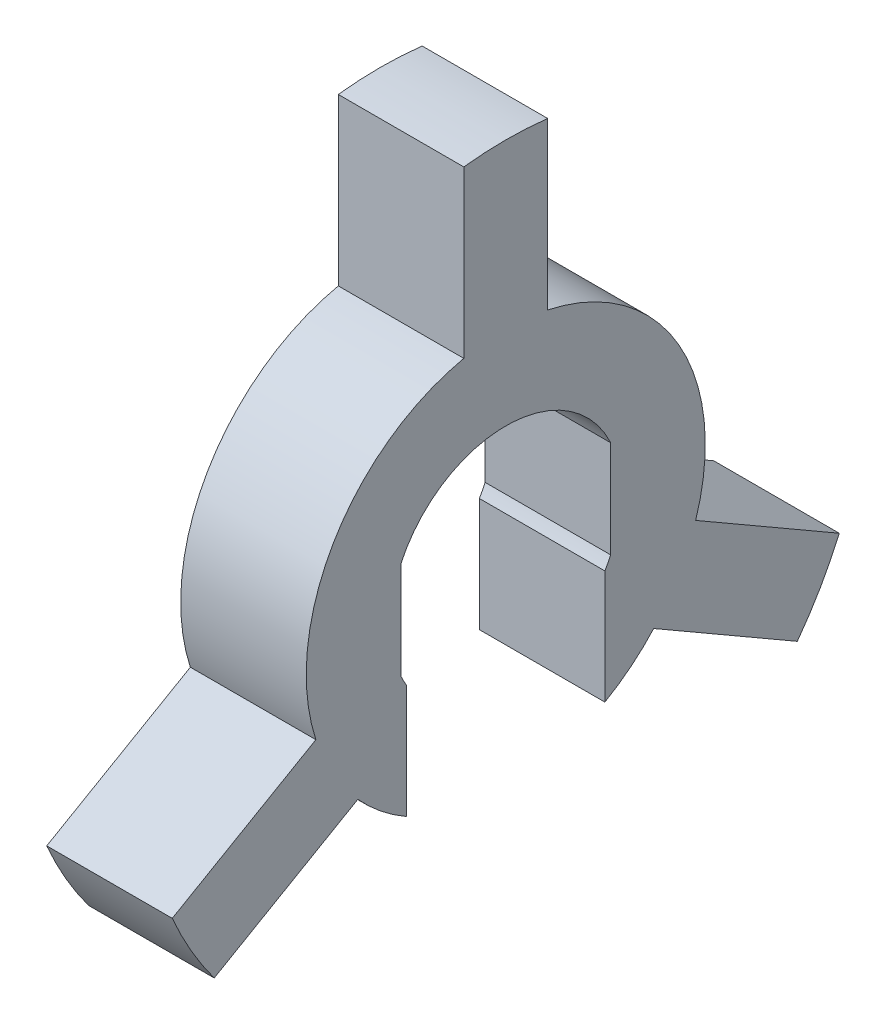
ISO-10303-21;
HEADER;
FILE_DESCRIPTION(('STEP AP214'),'2;1');
FILE_NAME('part.step','',(''),(''),'','','');
FILE_SCHEMA(('AUTOMOTIVE_DESIGN { 1 0 10303 214 1 1 1 1 }'));
ENDSEC;
DATA;
#1=APPLICATION_CONTEXT('core data for automotive mechanical design processes');
#2=APPLICATION_PROTOCOL_DEFINITION('international standard','automotive_design',2000,#1);
#3=PRODUCT_CONTEXT('',#1,'mechanical');
#4=PRODUCT('Part','Part','',(#3));
#5=PRODUCT_RELATED_PRODUCT_CATEGORY('part','',(#4));
#6=PRODUCT_DEFINITION_FORMATION('','',#4);
#7=PRODUCT_DEFINITION_CONTEXT('part definition',#1,'design');
#8=PRODUCT_DEFINITION('design','',#6,#7);
#9=PRODUCT_DEFINITION_SHAPE('','',#8);
#10=(LENGTH_UNIT() NAMED_UNIT(*) SI_UNIT(.MILLI.,.METRE.));
#11=(NAMED_UNIT(*) PLANE_ANGLE_UNIT() SI_UNIT($,.RADIAN.));
#12=(NAMED_UNIT(*) SI_UNIT($,.STERADIAN.) SOLID_ANGLE_UNIT());
#13=UNCERTAINTY_MEASURE_WITH_UNIT(LENGTH_MEASURE(1.E-05),#10,'distance_accuracy_value','');
#14=(GEOMETRIC_REPRESENTATION_CONTEXT(3) GLOBAL_UNCERTAINTY_ASSIGNED_CONTEXT((#13)) GLOBAL_UNIT_ASSIGNED_CONTEXT((#10,
#11,#12)) REPRESENTATION_CONTEXT('',''));
#15=CARTESIAN_POINT('',(0.,0.,0.));
#16=DIRECTION('',(0.,0.,1.));
#17=DIRECTION('',(1.,0.,0.));
#18=AXIS2_PLACEMENT_3D('',#15,#16,#17);
#19=CARTESIAN_POINT('',(19.,0.,0.));
#20=DIRECTION('',(-1.,0.,0.));
#21=DIRECTION('',(0.,0.,1.));
#22=AXIS2_PLACEMENT_3D('',#19,#20,#21);
#23=CYLINDRICAL_SURFACE('',#22,17.5);
#24=CARTESIAN_POINT('',(0.,0.,0.));
#25=DIRECTION('',(-1.,0.,0.));
#26=DIRECTION('',(0.,0.,-1.));
#27=AXIS2_PLACEMENT_3D('',#24,#25,#26);
#28=CIRCLE('',#27,17.5);
#29=CARTESIAN_POINT('',(0.,7.35,15.8816718263538));
#30=VERTEX_POINT('',#29);
#31=CARTESIAN_POINT('',(0.,7.35,-15.8816718263538));
#32=VERTEX_POINT('',#31);
#33=EDGE_CURVE('E215',#30,#32,#28,.T.);
#34=ORIENTED_EDGE('',*,*,#33,.T.);
#35=DIRECTION('',(-1.,0.,0.));
#36=VECTOR('',#35,1.);
#37=CARTESIAN_POINT('',(19.,7.35,-15.8816718263538));
#38=LINE('',#37,#36);
#39=CARTESIAN_POINT('',(19.,7.35,-15.8816718263538));
#40=VERTEX_POINT('',#39);
#41=EDGE_CURVE('E11',#40,#32,#38,.T.);
#42=ORIENTED_EDGE('',*,*,#41,.F.);
#43=CARTESIAN_POINT('',(19.,0.,0.));
#44=DIRECTION('',(-1.,0.,0.));
#45=DIRECTION('',(0.,0.,-1.));
#46=AXIS2_PLACEMENT_3D('',#43,#44,#45);
#47=CIRCLE('',#46,17.5);
#48=CARTESIAN_POINT('',(19.,7.35,15.8816718263538));
#49=VERTEX_POINT('',#48);
#50=EDGE_CURVE('E273',#49,#40,#47,.T.);
#51=ORIENTED_EDGE('',*,*,#50,.F.);
#52=DIRECTION('',(-1.,0.,0.));
#53=VECTOR('',#52,1.);
#54=CARTESIAN_POINT('',(19.,7.35,15.8816718263538));
#55=LINE('',#54,#53);
#56=EDGE_CURVE('E211',#49,#30,#55,.T.);
#57=ORIENTED_EDGE('',*,*,#56,.T.);
#58=EDGE_LOOP('',(#34,#42,#51,#57));
#59=FACE_BOUND('',#58,.T.);
#60=ADVANCED_FACE('F42',(#59),#23,.F.);
#61=CARTESIAN_POINT('',(19.,7.35,-15.8816718263538));
#62=DIRECTION('',(0.,0.,-1.));
#63=DIRECTION('',(-1.,0.,0.));
#64=AXIS2_PLACEMENT_3D('',#61,#62,#63);
#65=PLANE('',#64);
#66=DIRECTION('',(0.,-1.,0.));
#67=VECTOR('',#66,1.);
#68=CARTESIAN_POINT('',(0.,7.35,-15.8816718263538));
#69=LINE('',#68,#67);
#70=CARTESIAN_POINT('',(0.,-7.35,-15.8816718263538));
#71=VERTEX_POINT('',#70);
#72=EDGE_CURVE('E219',#32,#71,#69,.T.);
#73=ORIENTED_EDGE('',*,*,#72,.T.);
#74=DIRECTION('',(-1.,0.,0.));
#75=VECTOR('',#74,1.);
#76=CARTESIAN_POINT('',(19.,-7.35,-15.8816718263538));
#77=LINE('',#76,#75);
#78=CARTESIAN_POINT('',(19.,-7.35,-15.8816718263538));
#79=VERTEX_POINT('',#78);
#80=EDGE_CURVE('E51',#79,#71,#77,.T.);
#81=ORIENTED_EDGE('',*,*,#80,.F.);
#82=DIRECTION('',(0.,-1.,0.));
#83=VECTOR('',#82,1.);
#84=CARTESIAN_POINT('',(19.,7.35,-15.8816718263538));
#85=LINE('',#84,#83);
#86=EDGE_CURVE('E138',#40,#79,#85,.T.);
#87=ORIENTED_EDGE('',*,*,#86,.F.);
#88=ORIENTED_EDGE('',*,*,#41,.T.);
#89=EDGE_LOOP('',(#73,#81,#87,#88));
#90=FACE_BOUND('',#89,.T.);
#91=ADVANCED_FACE('F423',(#90),#65,.F.);
#92=CARTESIAN_POINT('',(19.,0.,0.));
#93=DIRECTION('',(-1.,0.,0.));
#94=DIRECTION('',(0.,0.,1.));
#95=AXIS2_PLACEMENT_3D('',#92,#93,#94);
#96=CYLINDRICAL_SURFACE('',#95,17.5);
#97=CARTESIAN_POINT('',(0.,0.,0.));
#98=DIRECTION('',(-1.,0.,0.));
#99=DIRECTION('',(0.,0.,-1.));
#100=AXIS2_PLACEMENT_3D('',#97,#98,#99);
#101=CIRCLE('',#100,17.5);
#102=CARTESIAN_POINT('',(0.,-9.01387818865999,-15.));
#103=VERTEX_POINT('',#102);
#104=EDGE_CURVE('E222',#71,#103,#101,.T.);
#105=ORIENTED_EDGE('',*,*,#104,.T.);
#106=DIRECTION('',(-1.,0.,0.));
#107=VECTOR('',#106,1.);
#108=CARTESIAN_POINT('',(19.,-9.01387818865999,-15.));
#109=LINE('',#108,#107);
#110=CARTESIAN_POINT('',(19.,-9.01387818865999,-15.));
#111=VERTEX_POINT('',#110);
#112=EDGE_CURVE('E332',#111,#103,#109,.T.);
#113=ORIENTED_EDGE('',*,*,#112,.F.);
#114=CARTESIAN_POINT('',(19.,0.,0.));
#115=DIRECTION('',(-1.,0.,0.));
#116=DIRECTION('',(0.,0.,-1.));
#117=AXIS2_PLACEMENT_3D('',#114,#115,#116);
#118=CIRCLE('',#117,17.5);
#119=EDGE_CURVE('E342',#79,#111,#118,.T.);
#120=ORIENTED_EDGE('',*,*,#119,.F.);
#121=ORIENTED_EDGE('',*,*,#80,.T.);
#122=EDGE_LOOP('',(#105,#113,#120,#121));
#123=FACE_BOUND('',#122,.T.);
#124=ADVANCED_FACE('F340',(#123),#96,.F.);
#125=CARTESIAN_POINT('',(19.,-9.01387818865998,-15.));
#126=DIRECTION('',(0.,0.,-1.));
#127=DIRECTION('',(-1.,0.,0.));
#128=AXIS2_PLACEMENT_3D('',#125,#126,#127);
#129=PLANE('',#128);
#130=DIRECTION('',(0.,-1.,0.));
#131=VECTOR('',#130,1.);
#132=CARTESIAN_POINT('',(0.,-9.01387818865998,-15.));
#133=LINE('',#132,#131);
#134=CARTESIAN_POINT('',(0.,-26.2114478806494,-15.));
#135=VERTEX_POINT('',#134);
#136=EDGE_CURVE('E225',#103,#135,#133,.T.);
#137=ORIENTED_EDGE('',*,*,#136,.T.);
#138=DIRECTION('',(-1.,0.,0.));
#139=VECTOR('',#138,1.);
#140=CARTESIAN_POINT('',(19.,-26.2114478806494,-15.));
#141=LINE('',#140,#139);
#142=CARTESIAN_POINT('',(19.,-26.2114478806494,-15.));
#143=VERTEX_POINT('',#142);
#144=EDGE_CURVE('E328',#143,#135,#141,.T.);
#145=ORIENTED_EDGE('',*,*,#144,.F.);
#146=DIRECTION('',(0.,-1.,0.));
#147=VECTOR('',#146,1.);
#148=CARTESIAN_POINT('',(19.,-9.01387818865998,-15.));
#149=LINE('',#148,#147);
#150=EDGE_CURVE('E361',#111,#143,#149,.T.);
#151=ORIENTED_EDGE('',*,*,#150,.F.);
#152=ORIENTED_EDGE('',*,*,#112,.T.);
#153=EDGE_LOOP('',(#137,#145,#151,#152));
#154=FACE_BOUND('',#153,.T.);
#155=ADVANCED_FACE('F351',(#154),#129,.F.);
#156=CARTESIAN_POINT('',(19.,0.,0.));
#157=DIRECTION('',(-1.,0.,0.));
#158=DIRECTION('',(0.,0.,1.));
#159=AXIS2_PLACEMENT_3D('',#156,#157,#158);
#160=CYLINDRICAL_SURFACE('',#159,30.2);
#161=CARTESIAN_POINT('',(0.,0.,0.));
#162=DIRECTION('',(1.,0.,0.));
#163=DIRECTION('',(0.,0.,-1.));
#164=AXIS2_PLACEMENT_3D('',#161,#162,#163);
#165=CIRCLE('',#164,30.2);
#166=CARTESIAN_POINT('',(0.,-20.2616925162418,-22.3942808854687));
#167=VERTEX_POINT('',#166);
#168=EDGE_CURVE('E228',#135,#167,#165,.T.);
#169=ORIENTED_EDGE('',*,*,#168,.T.);
#170=DIRECTION('',(-1.,0.,0.));
#171=VECTOR('',#170,1.);
#172=CARTESIAN_POINT('',(19.,-20.2616925162418,-22.3942808854687));
#173=LINE('',#172,#171);
#174=CARTESIAN_POINT('',(19.,-20.2616925162418,-22.3942808854687));
#175=VERTEX_POINT('',#174);
#176=EDGE_CURVE('E324',#175,#167,#173,.T.);
#177=ORIENTED_EDGE('',*,*,#176,.F.);
#178=CARTESIAN_POINT('',(19.,0.,0.));
#179=DIRECTION('',(1.,0.,0.));
#180=DIRECTION('',(0.,0.,-1.));
#181=AXIS2_PLACEMENT_3D('',#178,#179,#180);
#182=CIRCLE('',#181,30.2);
#183=EDGE_CURVE('E357',#143,#175,#182,.T.);
#184=ORIENTED_EDGE('',*,*,#183,.F.);
#185=ORIENTED_EDGE('',*,*,#144,.T.);
#186=EDGE_LOOP('',(#169,#177,#184,#185));
#187=FACE_BOUND('',#186,.T.);
#188=ADVANCED_FACE('F355',(#187),#160,.T.);
#189=CARTESIAN_POINT('',(19.,-32.8108320350646,-44.13002812334));
#190=DIRECTION('',(0.,0.866025403784436,-0.500000000000004));
#191=DIRECTION('',(0.,0.500000000000004,0.866025403784436));
#192=AXIS2_PLACEMENT_3D('',#189,#190,#191);
#193=PLANE('',#192);
#194=DIRECTION('',(0.,-0.500000000000004,-0.866025403784436));
#195=VECTOR('',#194,1.);
#196=CARTESIAN_POINT('',(0.,-32.8108320350646,-44.13002812334));
#197=LINE('',#196,#195);
#198=CARTESIAN_POINT('',(0.,-32.8108320350646,-44.13002812334));
#199=VERTEX_POINT('',#198);
#200=EDGE_CURVE('E231',#167,#199,#197,.T.);
#201=ORIENTED_EDGE('',*,*,#200,.T.);
#202=DIRECTION('',(-1.,0.,0.));
#203=VECTOR('',#202,1.);
#204=CARTESIAN_POINT('',(19.,-32.8108320350646,-44.13002812334));
#205=LINE('',#204,#203);
#206=CARTESIAN_POINT('',(19.,-32.8108320350646,-44.13002812334));
#207=VERTEX_POINT('',#206);
#208=EDGE_CURVE('E320',#207,#199,#205,.T.);
#209=ORIENTED_EDGE('',*,*,#208,.F.);
#210=DIRECTION('',(0.,-0.500000000000004,-0.866025403784436));
#211=VECTOR('',#210,1.);
#212=CARTESIAN_POINT('',(19.,-32.8108320350646,-44.13002812334));
#213=LINE('',#212,#211);
#214=EDGE_CURVE('E360',#175,#207,#213,.T.);
#215=ORIENTED_EDGE('',*,*,#214,.F.);
#216=ORIENTED_EDGE('',*,*,#176,.T.);
#217=EDGE_LOOP('',(#201,#209,#215,#216));
#218=FACE_BOUND('',#217,.T.);
#219=ADVANCED_FACE('F436',(#218),#193,.F.);
#220=CARTESIAN_POINT('',(19.,0.,0.));
#221=DIRECTION('',(-1.,0.,0.));
#222=DIRECTION('',(0.,0.,1.));
#223=AXIS2_PLACEMENT_3D('',#220,#221,#222);
#224=CYLINDRICAL_SURFACE('',#223,54.991);
#225=CARTESIAN_POINT('',(0.,0.,0.));
#226=DIRECTION('',(1.,0.,0.));
#227=DIRECTION('',(0.,0.,-1.));
#228=AXIS2_PLACEMENT_3D('',#225,#226,#227);
#229=CIRCLE('',#228,54.991);
#230=CARTESIAN_POINT('',(0.,-21.8123094070023,-50.48002812334));
#231=VERTEX_POINT('',#230);
#232=EDGE_CURVE('E234',#199,#231,#229,.T.);
#233=ORIENTED_EDGE('',*,*,#232,.T.);
#234=DIRECTION('',(-1.,0.,0.));
#235=VECTOR('',#234,1.);
#236=CARTESIAN_POINT('',(19.,-21.8123094070023,-50.48002812334));
#237=LINE('',#236,#235);
#238=CARTESIAN_POINT('',(19.,-21.8123094070023,-50.48002812334));
#239=VERTEX_POINT('',#238);
#240=EDGE_CURVE('E316',#239,#231,#237,.T.);
#241=ORIENTED_EDGE('',*,*,#240,.F.);
#242=CARTESIAN_POINT('',(19.,0.,0.));
#243=DIRECTION('',(1.,0.,0.));
#244=DIRECTION('',(0.,0.,-1.));
#245=AXIS2_PLACEMENT_3D('',#242,#243,#244);
#246=CIRCLE('',#245,54.991);
#247=EDGE_CURVE('E365',#207,#239,#246,.T.);
#248=ORIENTED_EDGE('',*,*,#247,.F.);
#249=ORIENTED_EDGE('',*,*,#208,.T.);
#250=EDGE_LOOP('',(#233,#241,#248,#249));
#251=FACE_BOUND('',#250,.T.);
#252=ADVANCED_FACE('F439',(#251),#224,.T.);
#253=CARTESIAN_POINT('',(19.,-21.8123094070023,-50.48002812334));
#254=DIRECTION('',(0.,-0.866025403784436,0.500000000000004));
#255=DIRECTION('',(0.,-0.500000000000004,-0.866025403784436));
#256=AXIS2_PLACEMENT_3D('',#253,#254,#255);
#257=PLANE('',#256);
#258=DIRECTION('',(0.,0.500000000000004,0.866025403784436));
#259=VECTOR('',#258,1.);
#260=CARTESIAN_POINT('',(0.,-21.8123094070023,-50.48002812334));
#261=LINE('',#260,#259);
#262=CARTESIAN_POINT('',(0.,-9.26316988817951,-28.7442808854688));
#263=VERTEX_POINT('',#262);
#264=EDGE_CURVE('E237',#231,#263,#261,.T.);
#265=ORIENTED_EDGE('',*,*,#264,.T.);
#266=DIRECTION('',(-1.,0.,0.));
#267=VECTOR('',#266,1.);
#268=CARTESIAN_POINT('',(19.,-9.26316988817951,-28.7442808854688));
#269=LINE('',#268,#267);
#270=CARTESIAN_POINT('',(19.,-9.26316988817951,-28.7442808854688));
#271=VERTEX_POINT('',#270);
#272=EDGE_CURVE('E312',#271,#263,#269,.T.);
#273=ORIENTED_EDGE('',*,*,#272,.F.);
#274=DIRECTION('',(0.,0.500000000000004,0.866025403784436));
#275=VECTOR('',#274,1.);
#276=CARTESIAN_POINT('',(19.,-21.8123094070023,-50.48002812334));
#277=LINE('',#276,#275);
#278=EDGE_CURVE('E372',#239,#271,#277,.T.);
#279=ORIENTED_EDGE('',*,*,#278,.F.);
#280=ORIENTED_EDGE('',*,*,#240,.T.);
#281=EDGE_LOOP('',(#265,#273,#279,#280));
#282=FACE_BOUND('',#281,.T.);
#283=ADVANCED_FACE('F443',(#282),#257,.F.);
#284=CARTESIAN_POINT('',(19.,0.,0.));
#285=DIRECTION('',(-1.,0.,0.));
#286=DIRECTION('',(0.,0.,1.));
#287=AXIS2_PLACEMENT_3D('',#284,#285,#286);
#288=CYLINDRICAL_SURFACE('',#287,30.2);
#289=CARTESIAN_POINT('',(0.,0.,0.));
#290=DIRECTION('',(1.,0.,0.));
#291=DIRECTION('',(0.,0.,-1.));
#292=AXIS2_PLACEMENT_3D('',#289,#290,#291);
#293=CIRCLE('',#292,30.2);
#294=CARTESIAN_POINT('',(0.,29.5248624044211,-6.34999999999998));
#295=VERTEX_POINT('',#294);
#296=EDGE_CURVE('E240',#263,#295,#293,.T.);
#297=ORIENTED_EDGE('',*,*,#296,.T.);
#298=DIRECTION('',(-1.,0.,0.));
#299=VECTOR('',#298,1.);
#300=CARTESIAN_POINT('',(19.,29.5248624044211,-6.34999999999998));
#301=LINE('',#300,#299);
#302=CARTESIAN_POINT('',(19.,29.5248624044211,-6.34999999999998));
#303=VERTEX_POINT('',#302);
#304=EDGE_CURVE('E308',#303,#295,#301,.T.);
#305=ORIENTED_EDGE('',*,*,#304,.F.);
#306=CARTESIAN_POINT('',(19.,0.,0.));
#307=DIRECTION('',(1.,0.,0.));
#308=DIRECTION('',(0.,0.,-1.));
#309=AXIS2_PLACEMENT_3D('',#306,#307,#308);
#310=CIRCLE('',#309,30.2);
#311=EDGE_CURVE('E375',#271,#303,#310,.T.);
#312=ORIENTED_EDGE('',*,*,#311,.F.);
#313=ORIENTED_EDGE('',*,*,#272,.T.);
#314=EDGE_LOOP('',(#297,#305,#312,#313));
#315=FACE_BOUND('',#314,.T.);
#316=ADVANCED_FACE('F447',(#315),#288,.T.);
#317=CARTESIAN_POINT('',(19.,54.6231414420665,-6.34999999999999));
#318=DIRECTION('',(0.,0.,1.));
#319=DIRECTION('',(1.,0.,0.));
#320=AXIS2_PLACEMENT_3D('',#317,#318,#319);
#321=PLANE('',#320);
#322=DIRECTION('',(0.,1.,0.));
#323=VECTOR('',#322,1.);
#324=CARTESIAN_POINT('',(0.,54.6231414420665,-6.34999999999999));
#325=LINE('',#324,#323);
#326=CARTESIAN_POINT('',(0.,54.6231414420665,-6.34999999999999));
#327=VERTEX_POINT('',#326);
#328=EDGE_CURVE('E243',#295,#327,#325,.T.);
#329=ORIENTED_EDGE('',*,*,#328,.T.);
#330=DIRECTION('',(-1.,0.,0.));
#331=VECTOR('',#330,1.);
#332=CARTESIAN_POINT('',(19.,54.6231414420665,-6.34999999999999));
#333=LINE('',#332,#331);
#334=CARTESIAN_POINT('',(19.,54.6231414420665,-6.34999999999999));
#335=VERTEX_POINT('',#334);
#336=EDGE_CURVE('E304',#335,#327,#333,.T.);
#337=ORIENTED_EDGE('',*,*,#336,.F.);
#338=DIRECTION('',(0.,1.,0.));
#339=VECTOR('',#338,1.);
#340=CARTESIAN_POINT('',(19.,54.6231414420665,-6.34999999999999));
#341=LINE('',#340,#339);
#342=EDGE_CURVE('E378',#303,#335,#341,.T.);
#343=ORIENTED_EDGE('',*,*,#342,.F.);
#344=ORIENTED_EDGE('',*,*,#304,.T.);
#345=EDGE_LOOP('',(#329,#337,#343,#344));
#346=FACE_BOUND('',#345,.T.);
#347=ADVANCED_FACE('F451',(#346),#321,.F.);
#348=CARTESIAN_POINT('',(19.,0.,0.));
#349=DIRECTION('',(-1.,0.,0.));
#350=DIRECTION('',(0.,0.,1.));
#351=AXIS2_PLACEMENT_3D('',#348,#349,#350);
#352=CYLINDRICAL_SURFACE('',#351,54.991);
#353=CARTESIAN_POINT('',(0.,0.,0.));
#354=DIRECTION('',(1.,0.,0.));
#355=DIRECTION('',(0.,0.,-1.));
#356=AXIS2_PLACEMENT_3D('',#353,#354,#355);
#357=CIRCLE('',#356,54.991);
#358=CARTESIAN_POINT('',(0.,54.6231414420665,6.35000000000002));
#359=VERTEX_POINT('',#358);
#360=EDGE_CURVE('E246',#327,#359,#357,.T.);
#361=ORIENTED_EDGE('',*,*,#360,.T.);
#362=DIRECTION('',(-1.,0.,0.));
#363=VECTOR('',#362,1.);
#364=CARTESIAN_POINT('',(19.,54.6231414420665,6.35000000000002));
#365=LINE('',#364,#363);
#366=CARTESIAN_POINT('',(19.,54.6231414420665,6.35000000000002));
#367=VERTEX_POINT('',#366);
#368=EDGE_CURVE('E300',#367,#359,#365,.T.);
#369=ORIENTED_EDGE('',*,*,#368,.F.);
#370=CARTESIAN_POINT('',(19.,0.,0.));
#371=DIRECTION('',(1.,0.,0.));
#372=DIRECTION('',(0.,0.,-1.));
#373=AXIS2_PLACEMENT_3D('',#370,#371,#372);
#374=CIRCLE('',#373,54.991);
#375=EDGE_CURVE('E381',#335,#367,#374,.T.);
#376=ORIENTED_EDGE('',*,*,#375,.F.);
#377=ORIENTED_EDGE('',*,*,#336,.T.);
#378=EDGE_LOOP('',(#361,#369,#376,#377));
#379=FACE_BOUND('',#378,.T.);
#380=ADVANCED_FACE('F455',(#379),#352,.T.);
#381=CARTESIAN_POINT('',(19.,54.6231414420665,6.35000000000001));
#382=DIRECTION('',(0.,0.,-1.));
#383=DIRECTION('',(-1.,0.,0.));
#384=AXIS2_PLACEMENT_3D('',#381,#382,#383);
#385=PLANE('',#384);
#386=DIRECTION('',(0.,-1.,0.));
#387=VECTOR('',#386,1.);
#388=CARTESIAN_POINT('',(0.,54.6231414420665,6.35000000000001));
#389=LINE('',#388,#387);
#390=CARTESIAN_POINT('',(0.,29.5248624044211,6.35000000000001));
#391=VERTEX_POINT('',#390);
#392=EDGE_CURVE('E249',#359,#391,#389,.T.);
#393=ORIENTED_EDGE('',*,*,#392,.T.);
#394=DIRECTION('',(-1.,0.,0.));
#395=VECTOR('',#394,1.);
#396=CARTESIAN_POINT('',(19.,29.5248624044211,6.35000000000001));
#397=LINE('',#396,#395);
#398=CARTESIAN_POINT('',(19.,29.5248624044211,6.35000000000001));
#399=VERTEX_POINT('',#398);
#400=EDGE_CURVE('E296',#399,#391,#397,.T.);
#401=ORIENTED_EDGE('',*,*,#400,.F.);
#402=DIRECTION('',(0.,-1.,0.));
#403=VECTOR('',#402,1.);
#404=CARTESIAN_POINT('',(19.,54.6231414420665,6.35000000000001));
#405=LINE('',#404,#403);
#406=EDGE_CURVE('E384',#367,#399,#405,.T.);
#407=ORIENTED_EDGE('',*,*,#406,.F.);
#408=ORIENTED_EDGE('',*,*,#368,.T.);
#409=EDGE_LOOP('',(#393,#401,#407,#408));
#410=FACE_BOUND('',#409,.T.);
#411=ADVANCED_FACE('F459',(#410),#385,.F.);
#412=CARTESIAN_POINT('',(19.,0.,0.));
#413=DIRECTION('',(-1.,0.,0.));
#414=DIRECTION('',(0.,0.,1.));
#415=AXIS2_PLACEMENT_3D('',#412,#413,#414);
#416=CYLINDRICAL_SURFACE('',#415,30.2);
#417=CARTESIAN_POINT('',(0.,0.,0.));
#418=DIRECTION('',(1.,0.,0.));
#419=DIRECTION('',(0.,0.,-1.));
#420=AXIS2_PLACEMENT_3D('',#417,#418,#419);
#421=CIRCLE('',#420,30.2);
#422=CARTESIAN_POINT('',(0.,-9.26316988817912,28.7442808854689));
#423=VERTEX_POINT('',#422);
#424=EDGE_CURVE('E252',#391,#423,#421,.T.);
#425=ORIENTED_EDGE('',*,*,#424,.T.);
#426=DIRECTION('',(-1.,0.,0.));
#427=VECTOR('',#426,1.);
#428=CARTESIAN_POINT('',(19.,-9.26316988817912,28.7442808854689));
#429=LINE('',#428,#427);
#430=CARTESIAN_POINT('',(19.,-9.26316988817912,28.7442808854689));
#431=VERTEX_POINT('',#430);
#432=EDGE_CURVE('E292',#431,#423,#429,.T.);
#433=ORIENTED_EDGE('',*,*,#432,.F.);
#434=CARTESIAN_POINT('',(19.,0.,0.));
#435=DIRECTION('',(1.,0.,0.));
#436=DIRECTION('',(0.,0.,-1.));
#437=AXIS2_PLACEMENT_3D('',#434,#435,#436);
#438=CIRCLE('',#437,30.2);
#439=EDGE_CURVE('E387',#399,#431,#438,.T.);
#440=ORIENTED_EDGE('',*,*,#439,.F.);
#441=ORIENTED_EDGE('',*,*,#400,.T.);
#442=EDGE_LOOP('',(#425,#433,#440,#441));
#443=FACE_BOUND('',#442,.T.);
#444=ADVANCED_FACE('F463',(#443),#416,.T.);
#445=CARTESIAN_POINT('',(19.,-21.8123094070016,50.4800281233403));
#446=DIRECTION('',(0.,-0.866025403784443,-0.499999999999992));
#447=DIRECTION('',(0.,0.499999999999992,-0.866025403784443));
#448=AXIS2_PLACEMENT_3D('',#445,#446,#447);
#449=PLANE('',#448);
#450=DIRECTION('',(0.,-0.499999999999992,0.866025403784443));
#451=VECTOR('',#450,1.);
#452=CARTESIAN_POINT('',(0.,-21.8123094070016,50.4800281233403));
#453=LINE('',#452,#451);
#454=CARTESIAN_POINT('',(0.,-21.8123094070016,50.4800281233403));
#455=VERTEX_POINT('',#454);
#456=EDGE_CURVE('E255',#423,#455,#453,.T.);
#457=ORIENTED_EDGE('',*,*,#456,.T.);
#458=DIRECTION('',(-1.,0.,0.));
#459=VECTOR('',#458,1.);
#460=CARTESIAN_POINT('',(19.,-21.8123094070016,50.4800281233403));
#461=LINE('',#460,#459);
#462=CARTESIAN_POINT('',(19.,-21.8123094070016,50.4800281233403));
#463=VERTEX_POINT('',#462);
#464=EDGE_CURVE('E288',#463,#455,#461,.T.);
#465=ORIENTED_EDGE('',*,*,#464,.F.);
#466=DIRECTION('',(0.,-0.499999999999992,0.866025403784443));
#467=VECTOR('',#466,1.);
#468=CARTESIAN_POINT('',(19.,-21.8123094070016,50.4800281233403));
#469=LINE('',#468,#467);
#470=EDGE_CURVE('E390',#431,#463,#469,.T.);
#471=ORIENTED_EDGE('',*,*,#470,.F.);
#472=ORIENTED_EDGE('',*,*,#432,.T.);
#473=EDGE_LOOP('',(#457,#465,#471,#472));
#474=FACE_BOUND('',#473,.T.);
#475=ADVANCED_FACE('F467',(#474),#449,.F.);
#476=CARTESIAN_POINT('',(19.,0.,0.));
#477=DIRECTION('',(-1.,0.,0.));
#478=DIRECTION('',(0.,0.,1.));
#479=AXIS2_PLACEMENT_3D('',#476,#477,#478);
#480=CYLINDRICAL_SURFACE('',#479,54.991);
#481=CARTESIAN_POINT('',(0.,0.,0.));
#482=DIRECTION('',(1.,0.,0.));
#483=DIRECTION('',(0.,0.,-1.));
#484=AXIS2_PLACEMENT_3D('',#481,#482,#483);
#485=CIRCLE('',#484,54.991);
#486=CARTESIAN_POINT('',(0.,-32.810832035064,44.1300281233404));
#487=VERTEX_POINT('',#486);
#488=EDGE_CURVE('E258',#455,#487,#485,.T.);
#489=ORIENTED_EDGE('',*,*,#488,.T.);
#490=DIRECTION('',(-1.,0.,0.));
#491=VECTOR('',#490,1.);
#492=CARTESIAN_POINT('',(19.,-32.810832035064,44.1300281233404));
#493=LINE('',#492,#491);
#494=CARTESIAN_POINT('',(19.,-32.810832035064,44.1300281233404));
#495=VERTEX_POINT('',#494);
#496=EDGE_CURVE('E284',#495,#487,#493,.T.);
#497=ORIENTED_EDGE('',*,*,#496,.F.);
#498=CARTESIAN_POINT('',(19.,0.,0.));
#499=DIRECTION('',(1.,0.,0.));
#500=DIRECTION('',(0.,0.,-1.));
#501=AXIS2_PLACEMENT_3D('',#498,#499,#500);
#502=CIRCLE('',#501,54.991);
#503=EDGE_CURVE('E393',#463,#495,#502,.T.);
#504=ORIENTED_EDGE('',*,*,#503,.F.);
#505=ORIENTED_EDGE('',*,*,#464,.T.);
#506=EDGE_LOOP('',(#489,#497,#504,#505));
#507=FACE_BOUND('',#506,.T.);
#508=ADVANCED_FACE('F471',(#507),#480,.T.);
#509=CARTESIAN_POINT('',(19.,-32.810832035064,44.1300281233404));
#510=DIRECTION('',(0.,0.866025403784443,0.499999999999992));
#511=DIRECTION('',(0.,-0.499999999999992,0.866025403784443));
#512=AXIS2_PLACEMENT_3D('',#509,#510,#511);
#513=PLANE('',#512);
#514=DIRECTION('',(0.,0.499999999999992,-0.866025403784443));
#515=VECTOR('',#514,1.);
#516=CARTESIAN_POINT('',(0.,-32.810832035064,44.1300281233404));
#517=LINE('',#516,#515);
#518=CARTESIAN_POINT('',(0.,-20.2616925162416,22.394280885469));
#519=VERTEX_POINT('',#518);
#520=EDGE_CURVE('E261',#487,#519,#517,.T.);
#521=ORIENTED_EDGE('',*,*,#520,.T.);
#522=DIRECTION('',(-1.,0.,0.));
#523=VECTOR('',#522,1.);
#524=CARTESIAN_POINT('',(19.,-20.2616925162416,22.394280885469));
#525=LINE('',#524,#523);
#526=CARTESIAN_POINT('',(19.,-20.2616925162416,22.394280885469));
#527=VERTEX_POINT('',#526);
#528=EDGE_CURVE('E280',#527,#519,#525,.T.);
#529=ORIENTED_EDGE('',*,*,#528,.F.);
#530=DIRECTION('',(0.,0.499999999999992,-0.866025403784443));
#531=VECTOR('',#530,1.);
#532=CARTESIAN_POINT('',(19.,-32.810832035064,44.1300281233404));
#533=LINE('',#532,#531);
#534=EDGE_CURVE('E396',#495,#527,#533,.T.);
#535=ORIENTED_EDGE('',*,*,#534,.F.);
#536=ORIENTED_EDGE('',*,*,#496,.T.);
#537=EDGE_LOOP('',(#521,#529,#535,#536));
#538=FACE_BOUND('',#537,.T.);
#539=ADVANCED_FACE('F404',(#538),#513,.F.);
#540=CARTESIAN_POINT('',(19.,0.,0.));
#541=DIRECTION('',(-1.,0.,0.));
#542=DIRECTION('',(0.,0.,1.));
#543=AXIS2_PLACEMENT_3D('',#540,#541,#542);
#544=CYLINDRICAL_SURFACE('',#543,30.2);
#545=CARTESIAN_POINT('',(0.,0.,0.));
#546=DIRECTION('',(1.,0.,0.));
#547=DIRECTION('',(0.,0.,-1.));
#548=AXIS2_PLACEMENT_3D('',#545,#546,#547);
#549=CIRCLE('',#548,30.2);
#550=CARTESIAN_POINT('',(0.,-26.2114478806494,15.));
#551=VERTEX_POINT('',#550);
#552=EDGE_CURVE('E264',#519,#551,#549,.T.);
#553=ORIENTED_EDGE('',*,*,#552,.T.);
#554=DIRECTION('',(-1.,0.,0.));
#555=VECTOR('',#554,1.);
#556=CARTESIAN_POINT('',(19.,-26.2114478806494,15.));
#557=LINE('',#556,#555);
#558=CARTESIAN_POINT('',(19.,-26.2114478806494,15.));
#559=VERTEX_POINT('',#558);
#560=EDGE_CURVE('E204',#559,#551,#557,.T.);
#561=ORIENTED_EDGE('',*,*,#560,.F.);
#562=CARTESIAN_POINT('',(19.,0.,0.));
#563=DIRECTION('',(1.,0.,0.));
#564=DIRECTION('',(0.,0.,-1.));
#565=AXIS2_PLACEMENT_3D('',#562,#563,#564);
#566=CIRCLE('',#565,30.2);
#567=EDGE_CURVE('E193',#527,#559,#566,.T.);
#568=ORIENTED_EDGE('',*,*,#567,.F.);
#569=ORIENTED_EDGE('',*,*,#528,.T.);
#570=EDGE_LOOP('',(#553,#561,#568,#569));
#571=FACE_BOUND('',#570,.T.);
#572=ADVANCED_FACE('F408',(#571),#544,.T.);
#573=CARTESIAN_POINT('',(19.,-9.01387818865998,15.));
#574=DIRECTION('',(0.,0.,1.));
#575=DIRECTION('',(1.,0.,0.));
#576=AXIS2_PLACEMENT_3D('',#573,#574,#575);
#577=PLANE('',#576);
#578=DIRECTION('',(0.,1.,0.));
#579=VECTOR('',#578,1.);
#580=CARTESIAN_POINT('',(0.,-9.01387818865998,15.));
#581=LINE('',#580,#579);
#582=CARTESIAN_POINT('',(0.,-9.01387818865998,15.));
#583=VERTEX_POINT('',#582);
#584=EDGE_CURVE('E202',#551,#583,#581,.T.);
#585=ORIENTED_EDGE('',*,*,#584,.T.);
#586=DIRECTION('',(-1.,0.,0.));
#587=VECTOR('',#586,1.);
#588=CARTESIAN_POINT('',(19.,-9.01387818865998,15.));
#589=LINE('',#588,#587);
#590=CARTESIAN_POINT('',(19.,-9.01387818865998,15.));
#591=VERTEX_POINT('',#590);
#592=EDGE_CURVE('E199',#591,#583,#589,.T.);
#593=ORIENTED_EDGE('',*,*,#592,.F.);
#594=DIRECTION('',(0.,1.,0.));
#595=VECTOR('',#594,1.);
#596=CARTESIAN_POINT('',(19.,-9.01387818865998,15.));
#597=LINE('',#596,#595);
#598=EDGE_CURVE('E187',#559,#591,#597,.T.);
#599=ORIENTED_EDGE('',*,*,#598,.F.);
#600=ORIENTED_EDGE('',*,*,#560,.T.);
#601=EDGE_LOOP('',(#585,#593,#599,#600));
#602=FACE_BOUND('',#601,.T.);
#603=ADVANCED_FACE('F200',(#602),#577,.F.);
#604=CARTESIAN_POINT('',(19.,0.,0.));
#605=DIRECTION('',(-1.,0.,0.));
#606=DIRECTION('',(0.,0.,1.));
#607=AXIS2_PLACEMENT_3D('',#604,#605,#606);
#608=CYLINDRICAL_SURFACE('',#607,17.5);
#609=CARTESIAN_POINT('',(0.,0.,0.));
#610=DIRECTION('',(-1.,0.,0.));
#611=DIRECTION('',(0.,0.,-1.));
#612=AXIS2_PLACEMENT_3D('',#609,#610,#611);
#613=CIRCLE('',#612,17.5);
#614=CARTESIAN_POINT('',(0.,-7.34999999999999,15.8816718263538));
#615=VERTEX_POINT('',#614);
#616=EDGE_CURVE('E124',#583,#615,#613,.T.);
#617=ORIENTED_EDGE('',*,*,#616,.T.);
#618=DIRECTION('',(-1.,0.,0.));
#619=VECTOR('',#618,1.);
#620=CARTESIAN_POINT('',(19.,-7.34999999999999,15.8816718263538));
#621=LINE('',#620,#619);
#622=CARTESIAN_POINT('',(19.,-7.34999999999999,15.8816718263538));
#623=VERTEX_POINT('',#622);
#624=EDGE_CURVE('E205',#623,#615,#621,.T.);
#625=ORIENTED_EDGE('',*,*,#624,.F.);
#626=CARTESIAN_POINT('',(19.,0.,0.));
#627=DIRECTION('',(-1.,0.,0.));
#628=DIRECTION('',(0.,0.,-1.));
#629=AXIS2_PLACEMENT_3D('',#626,#627,#628);
#630=CIRCLE('',#629,17.5);
#631=EDGE_CURVE('E191',#591,#623,#630,.T.);
#632=ORIENTED_EDGE('',*,*,#631,.F.);
#633=ORIENTED_EDGE('',*,*,#592,.T.);
#634=EDGE_LOOP('',(#617,#625,#632,#633));
#635=FACE_BOUND('',#634,.T.);
#636=ADVANCED_FACE('F207',(#635),#608,.F.);
#637=CARTESIAN_POINT('',(19.,7.35,15.8816718263538));
#638=DIRECTION('',(0.,0.,1.));
#639=DIRECTION('',(1.,0.,0.));
#640=AXIS2_PLACEMENT_3D('',#637,#638,#639);
#641=PLANE('',#640);
#642=DIRECTION('',(0.,1.,0.));
#643=VECTOR('',#642,1.);
#644=CARTESIAN_POINT('',(0.,7.35,15.8816718263538));
#645=LINE('',#644,#643);
#646=EDGE_CURVE('E130',#615,#30,#645,.T.);
#647=ORIENTED_EDGE('',*,*,#646,.T.);
#648=ORIENTED_EDGE('',*,*,#56,.F.);
#649=DIRECTION('',(0.,1.,0.));
#650=VECTOR('',#649,1.);
#651=CARTESIAN_POINT('',(19.,7.35,15.8816718263538));
#652=LINE('',#651,#650);
#653=EDGE_CURVE('E59',#623,#49,#652,.T.);
#654=ORIENTED_EDGE('',*,*,#653,.F.);
#655=ORIENTED_EDGE('',*,*,#624,.T.);
#656=EDGE_LOOP('',(#647,#648,#654,#655));
#657=FACE_BOUND('',#656,.T.);
#658=ADVANCED_FACE('F412',(#657),#641,.F.);
#659=CARTESIAN_POINT('',(19.,0.,0.));
#660=DIRECTION('',(1.,0.,0.));
#661=DIRECTION('',(0.,0.,-1.));
#662=AXIS2_PLACEMENT_3D('',#659,#660,#661);
#663=PLANE('',#662);
#664=ORIENTED_EDGE('',*,*,#50,.T.);
#665=ORIENTED_EDGE('',*,*,#86,.T.);
#666=ORIENTED_EDGE('',*,*,#119,.T.);
#667=ORIENTED_EDGE('',*,*,#150,.T.);
#668=ORIENTED_EDGE('',*,*,#183,.T.);
#669=ORIENTED_EDGE('',*,*,#214,.T.);
#670=ORIENTED_EDGE('',*,*,#247,.T.);
#671=ORIENTED_EDGE('',*,*,#278,.T.);
#672=ORIENTED_EDGE('',*,*,#311,.T.);
#673=ORIENTED_EDGE('',*,*,#342,.T.);
#674=ORIENTED_EDGE('',*,*,#375,.T.);
#675=ORIENTED_EDGE('',*,*,#406,.T.);
#676=ORIENTED_EDGE('',*,*,#439,.T.);
#677=ORIENTED_EDGE('',*,*,#470,.T.);
#678=ORIENTED_EDGE('',*,*,#503,.T.);
#679=ORIENTED_EDGE('',*,*,#534,.T.);
#680=ORIENTED_EDGE('',*,*,#567,.T.);
#681=ORIENTED_EDGE('',*,*,#598,.T.);
#682=ORIENTED_EDGE('',*,*,#631,.T.);
#683=ORIENTED_EDGE('',*,*,#653,.T.);
#684=EDGE_LOOP('',(#664,#665,#666,#667,#668,#669,#670,#671,#672,#673,#674,#675,#676,#677,#678,
#679,#680,#681,#682,#683));
#685=FACE_BOUND('',#684,.T.);
#686=ADVANCED_FACE('F189',(#685),#663,.T.);
#687=CARTESIAN_POINT('',(0.,0.,0.));
#688=DIRECTION('',(1.,0.,0.));
#689=DIRECTION('',(0.,0.,-1.));
#690=AXIS2_PLACEMENT_3D('',#687,#688,#689);
#691=PLANE('',#690);
#692=ORIENTED_EDGE('',*,*,#33,.F.);
#693=ORIENTED_EDGE('',*,*,#646,.F.);
#694=ORIENTED_EDGE('',*,*,#616,.F.);
#695=ORIENTED_EDGE('',*,*,#584,.F.);
#696=ORIENTED_EDGE('',*,*,#552,.F.);
#697=ORIENTED_EDGE('',*,*,#520,.F.);
#698=ORIENTED_EDGE('',*,*,#488,.F.);
#699=ORIENTED_EDGE('',*,*,#456,.F.);
#700=ORIENTED_EDGE('',*,*,#424,.F.);
#701=ORIENTED_EDGE('',*,*,#392,.F.);
#702=ORIENTED_EDGE('',*,*,#360,.F.);
#703=ORIENTED_EDGE('',*,*,#328,.F.);
#704=ORIENTED_EDGE('',*,*,#296,.F.);
#705=ORIENTED_EDGE('',*,*,#264,.F.);
#706=ORIENTED_EDGE('',*,*,#232,.F.);
#707=ORIENTED_EDGE('',*,*,#200,.F.);
#708=ORIENTED_EDGE('',*,*,#168,.F.);
#709=ORIENTED_EDGE('',*,*,#136,.F.);
#710=ORIENTED_EDGE('',*,*,#104,.F.);
#711=ORIENTED_EDGE('',*,*,#72,.F.);
#712=EDGE_LOOP('',(#692,#693,#694,#695,#696,#697,#698,#699,#700,#701,#702,#703,#704,#705,#706,
#707,#708,#709,#710,#711));
#713=FACE_BOUND('',#712,.T.);
#714=ADVANCED_FACE('F346',(#713),#691,.F.);
#715=CLOSED_SHELL('',(#60,#91,#124,#155,#188,#219,#252,#283,#316,#347,#380,#411,#444,#475,#508,
#539,#572,#603,#636,#658,#686,#714));
#716=MANIFOLD_SOLID_BREP('B2',#715);
#717=ADVANCED_BREP_SHAPE_REPRESENTATION('',(#18,#716),#14);
#718=SHAPE_DEFINITION_REPRESENTATION(#9,#717);
ENDSEC;
END-ISO-10303-21;
